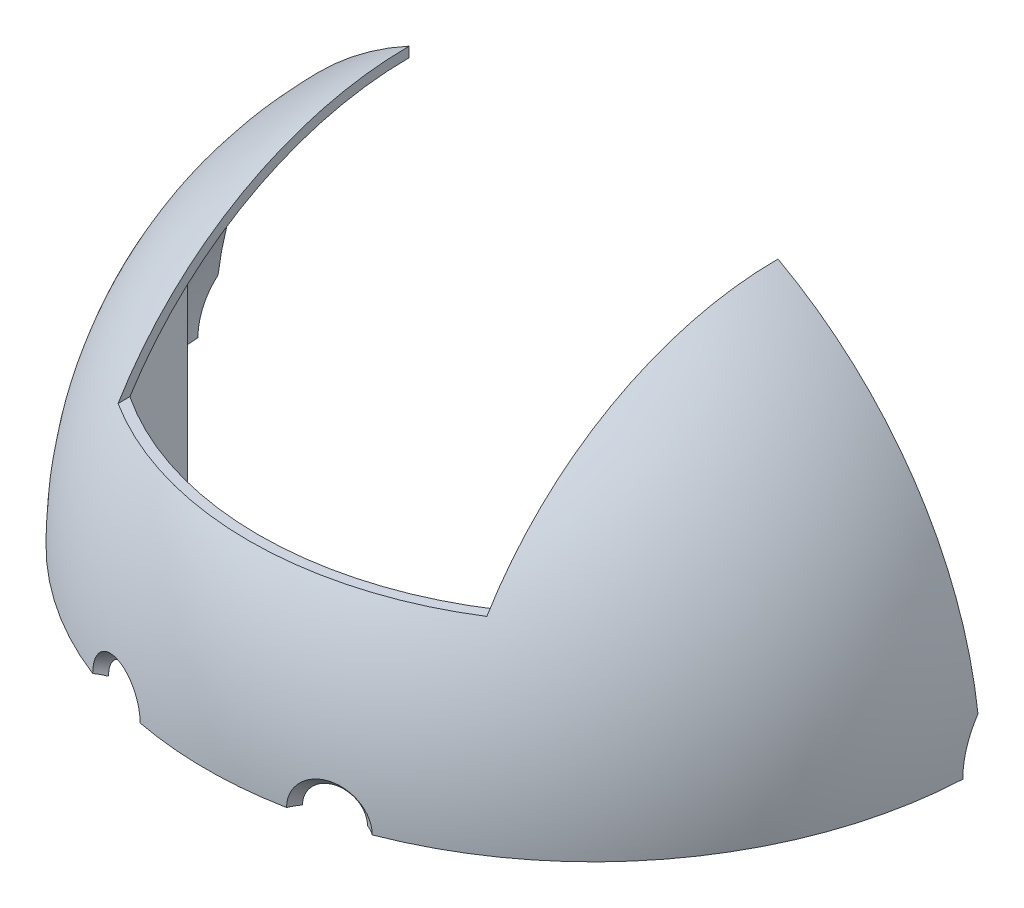
ISO-10303-21;
HEADER;
FILE_DESCRIPTION(('STEP AP214'),'2;1');
FILE_NAME('part.step','',(''),(''),'','','');
FILE_SCHEMA(('AUTOMOTIVE_DESIGN { 1 0 10303 214 1 1 1 1 }'));
ENDSEC;
DATA;
#1=APPLICATION_CONTEXT('core data for automotive mechanical design processes');
#2=APPLICATION_PROTOCOL_DEFINITION('international standard','automotive_design',2000,#1);
#3=PRODUCT_CONTEXT('',#1,'mechanical');
#4=PRODUCT('Part','Part','',(#3));
#5=PRODUCT_RELATED_PRODUCT_CATEGORY('part','',(#4));
#6=PRODUCT_DEFINITION_FORMATION('','',#4);
#7=PRODUCT_DEFINITION_CONTEXT('part definition',#1,'design');
#8=PRODUCT_DEFINITION('design','',#6,#7);
#9=PRODUCT_DEFINITION_SHAPE('','',#8);
#10=(LENGTH_UNIT() NAMED_UNIT(*) SI_UNIT(.MILLI.,.METRE.));
#11=(NAMED_UNIT(*) PLANE_ANGLE_UNIT() SI_UNIT($,.RADIAN.));
#12=(NAMED_UNIT(*) SI_UNIT($,.STERADIAN.) SOLID_ANGLE_UNIT());
#13=UNCERTAINTY_MEASURE_WITH_UNIT(LENGTH_MEASURE(1.E-05),#10,'distance_accuracy_value','');
#14=(GEOMETRIC_REPRESENTATION_CONTEXT(3) GLOBAL_UNCERTAINTY_ASSIGNED_CONTEXT((#13)) GLOBAL_UNIT_ASSIGNED_CONTEXT((#10,
#11,#12)) REPRESENTATION_CONTEXT('',''));
#15=CARTESIAN_POINT('',(0.,0.,0.));
#16=DIRECTION('',(0.,0.,1.));
#17=DIRECTION('',(1.,0.,0.));
#18=AXIS2_PLACEMENT_3D('',#15,#16,#17);
#19=CARTESIAN_POINT('',(0.,0.,25.4));
#20=DIRECTION('',(1.,0.,0.));
#21=DIRECTION('',(0.,1.,0.));
#22=AXIS2_PLACEMENT_3D('',#19,#20,#21);
#23=SPHERICAL_SURFACE('',#22,69.85);
#24=CARTESIAN_POINT('',(-19.2074436772505,0.,92.265971471552));
#25=DIRECTION('',(-0.276088046524378,0.,0.96113234810111));
#26=DIRECTION('',(0.96113234810111,0.,0.276088046524378));
#27=AXIS2_PLACEMENT_3D('',#24,#25,#26);
#28=CIRCLE('',#27,6.24807702824202);
#29=CARTESIAN_POINT('',(-13.2022147319796,0.,93.9909908528132));
#30=VERTEX_POINT('',#29);
#31=CARTESIAN_POINT('',(-25.2126726225213,0.,90.5409520902908));
#32=VERTEX_POINT('',#31);
#33=EDGE_CURVE('E177',#30,#32,#28,.T.);
#34=ORIENTED_EDGE('',*,*,#33,.F.);
#35=CARTESIAN_POINT('',(0.,0.,25.4));
#36=DIRECTION('',(0.,1.,0.));
#37=DIRECTION('',(0.,0.,-1.));
#38=AXIS2_PLACEMENT_3D('',#35,#36,#37);
#39=CIRCLE('',#38,69.85);
#40=CARTESIAN_POINT('',(13.2022147319796,0.,93.9909908528132));
#41=VERTEX_POINT('',#40);
#42=EDGE_CURVE('E186',#30,#41,#39,.T.);
#43=ORIENTED_EDGE('',*,*,#42,.T.);
#44=CARTESIAN_POINT('',(19.2074436772505,0.,92.265971471552));
#45=DIRECTION('',(0.276088046524378,0.,0.96113234810111));
#46=DIRECTION('',(0.96113234810111,0.,-0.276088046524378));
#47=AXIS2_PLACEMENT_3D('',#44,#45,#46);
#48=CIRCLE('',#47,6.24807702824202);
#49=CARTESIAN_POINT('',(25.2126726225213,0.,90.5409520902908));
#50=VERTEX_POINT('',#49);
#51=EDGE_CURVE('E250',#50,#41,#48,.T.);
#52=ORIENTED_EDGE('',*,*,#51,.F.);
#53=CARTESIAN_POINT('',(69.777803598279,0.,28.575));
#54=VERTEX_POINT('',#53);
#55=EDGE_CURVE('E196',#50,#54,#39,.T.);
#56=ORIENTED_EDGE('',*,*,#55,.T.);
#57=CARTESIAN_POINT('',(69.777803598064,-0.0002,28.5749999984252));
#58=CARTESIAN_POINT('',(69.7778094286927,0.35419238493466,28.5750454404267));
#59=CARTESIAN_POINT('',(69.7757804396735,0.708578025886953,28.5601789188218));
#60=CARTESIAN_POINT('',(69.7676893456543,1.41481913493722,28.5009092542895));
#61=CARTESIAN_POINT('',(69.7616273114968,1.76667464736844,28.4565066301789));
#62=CARTESIAN_POINT('',(69.74549664725,2.46578488457666,28.338378809471));
#63=CARTESIAN_POINT('',(69.7354230552833,2.81303335922335,28.2646172990596));
#64=CARTESIAN_POINT('',(69.7113421244648,3.49999314625604,28.0883438305232));
#65=CARTESIAN_POINT('',(69.6973350079172,3.83970488341228,27.9858334971454));
#66=CARTESIAN_POINT('',(69.6654751357279,4.50939441102191,27.7527583961394));
#67=CARTESIAN_POINT('',(69.6476201857103,4.83936652448324,27.6221776203617));
#68=CARTESIAN_POINT('',(69.6081933718184,5.48704875240924,27.3339669868172));
#69=CARTESIAN_POINT('',(69.5866215317765,5.80475894547963,27.1763373024843));
#70=CARTESIAN_POINT('',(69.5399673804505,6.4249444157689,26.8356113155748));
#71=CARTESIAN_POINT('',(69.5148934745958,6.72745388004004,26.6525759962917));
#72=CARTESIAN_POINT('',(69.4613780965593,7.31582988259074,26.2621631060731));
#73=CARTESIAN_POINT('',(69.4329386638847,7.60170634535006,26.0548002782436));
#74=CARTESIAN_POINT('',(69.3932555388993,7.96730068186584,25.7656533286922));
#75=CARTESIAN_POINT('',(69.3834279824395,8.05536684081896,25.6940605662914));
#76=CARTESIAN_POINT('',(69.3634592706024,8.22945153250354,25.548622434634));
#77=CARTESIAN_POINT('',(69.3533183957594,8.31547178152869,25.4747790812367));
#78=CARTESIAN_POINT('',(69.3430192232787,8.40048718587201,25.3998));
#79=B_SPLINE_CURVE_WITH_KNOTS('',3,(#57,#58,#59,#60,#61,#62,#63,#64,#65,#66,#67,#68,#69,#70,#71,
#72,#73,#74,#75,#76,#77,#78),.UNSPECIFIED.,.F.,.F.,(4,2,2,2,2,2,2,2,2,2,4),(0.,1.06284917204437,
2.12567967509618,3.18982889195358,4.25391798025308,5.31861552003499,6.38330623337973,
7.44548410846703,8.50702156921451,8.8487524031558,9.19018565776057),.UNSPECIFIED.);
#80=CARTESIAN_POINT('',(69.3430466953969,8.40026041263011,25.4));
#81=VERTEX_POINT('',#80);
#82=EDGE_CURVE('E238',#54,#81,#79,.T.);
#83=ORIENTED_EDGE('',*,*,#82,.T.);
#84=CARTESIAN_POINT('',(0.,0.,25.4));
#85=DIRECTION('',(0.,0.,-1.));
#86=DIRECTION('',(0.,-1.,0.));
#87=AXIS2_PLACEMENT_3D('',#84,#85,#86);
#88=CIRCLE('',#87,69.85);
#89=CARTESIAN_POINT('',(33.2590191582997,61.4236122727071,25.3999999999998));
#90=VERTEX_POINT('',#89);
#91=EDGE_CURVE('E200',#90,#81,#88,.T.);
#92=ORIENTED_EDGE('',*,*,#91,.F.);
#93=CARTESIAN_POINT('',(33.2590191582997,0.,25.4));
#94=DIRECTION('',(-1.,0.,0.));
#95=DIRECTION('',(0.,0.,1.));
#96=AXIS2_PLACEMENT_3D('',#93,#94,#95);
#97=CIRCLE('',#96,61.4236122727071);
#98=CARTESIAN_POINT('',(33.2590191582997,31.8494770449744,77.921147708228));
#99=VERTEX_POINT('',#98);
#100=EDGE_CURVE('E338',#99,#90,#97,.T.);
#101=ORIENTED_EDGE('',*,*,#100,.F.);
#102=CARTESIAN_POINT('',(0.,31.8494770449744,25.4));
#103=DIRECTION('',(0.,1.,0.));
#104=DIRECTION('',(0.,0.,1.));
#105=AXIS2_PLACEMENT_3D('',#102,#103,#104);
#106=CIRCLE('',#105,62.166174982555);
#107=CARTESIAN_POINT('',(-33.2590191582997,31.8494770449744,77.921147708228));
#108=VERTEX_POINT('',#107);
#109=EDGE_CURVE('E341',#108,#99,#106,.T.);
#110=ORIENTED_EDGE('',*,*,#109,.F.);
#111=CARTESIAN_POINT('',(-33.2590191582997,0.,25.4));
#112=DIRECTION('',(1.,0.,0.));
#113=DIRECTION('',(0.,0.,-1.));
#114=AXIS2_PLACEMENT_3D('',#111,#112,#113);
#115=CIRCLE('',#114,61.4236122727071);
#116=CARTESIAN_POINT('',(-33.2590191582997,61.4236122727071,25.3999999999998));
#117=VERTEX_POINT('',#116);
#118=EDGE_CURVE('E348',#117,#108,#115,.T.);
#119=ORIENTED_EDGE('',*,*,#118,.F.);
#120=CARTESIAN_POINT('',(-69.3430466953969,8.40026041263011,25.4));
#121=VERTEX_POINT('',#120);
#122=EDGE_CURVE('E205',#121,#117,#88,.T.);
#123=ORIENTED_EDGE('',*,*,#122,.F.);
#124=CARTESIAN_POINT('',(-69.3430192232787,8.40048718587201,25.3998));
#125=CARTESIAN_POINT('',(-69.3751919554918,8.13497556913375,25.6340214653112));
#126=CARTESIAN_POINT('',(-69.4058221966783,7.85951556077259,25.8571754418203));
#127=CARTESIAN_POINT('',(-69.4638058862443,7.29069001217986,26.2798613972095));
#128=CARTESIAN_POINT('',(-69.4911591987702,6.99732373035803,26.479392396734));
#129=CARTESIAN_POINT('',(-69.5424399560993,6.39416482943089,26.8536573134017));
#130=CARTESIAN_POINT('',(-69.5663612388711,6.08434399997873,27.0283466237371));
#131=CARTESIAN_POINT('',(-69.6105533918674,5.45095903302394,27.351208916315));
#132=CARTESIAN_POINT('',(-69.630824526799,5.1273958942123,27.4993838213654));
#133=CARTESIAN_POINT('',(-69.6675928156673,4.46850106258316,27.7682427958347));
#134=CARTESIAN_POINT('',(-69.6840866253628,4.1331592421357,27.8889025043742));
#135=CARTESIAN_POINT('',(-69.7131612950436,3.45336754140404,28.1016546543018));
#136=CARTESIAN_POINT('',(-69.7257422175212,3.10891780667628,28.1937475519261));
#137=CARTESIAN_POINT('',(-69.746875407551,2.41429207994767,28.3484720593326));
#138=CARTESIAN_POINT('',(-69.7554379653327,2.06413311671602,28.4111789202917));
#139=CARTESIAN_POINT('',(-69.7685181734764,1.35987050584993,28.5069795207709));
#140=CARTESIAN_POINT('',(-69.7730383637668,1.00576947694763,28.5400918553218));
#141=CARTESIAN_POINT('',(-69.7762846405911,0.542523168682234,28.5638726048134));
#142=CARTESIAN_POINT('',(-69.7768546589657,0.433972461882385,28.5680483497382));
#143=CARTESIAN_POINT('',(-69.7776140491352,0.216884931342977,28.5736113966535));
#144=CARTESIAN_POINT('',(-69.7778037242217,0.108348165607745,28.57500092042));
#145=CARTESIAN_POINT('',(-69.777803598064,-0.000200000000000019,28.5749999984252));
#146=B_SPLINE_CURVE_WITH_KNOTS('',3,(#124,#125,#126,#127,#128,#129,#130,#131,#132,#133,#134,
#135,#136,#137,#138,#139,#140,#141,#142,#143,#144,#145),.UNSPECIFIED.,.F.,.F.,(4,2,2,2,2,2,2,2,
2,2,4),(0.,1.06623370991969,2.1325116080268,3.20068061674634,4.26877213110154,5.33780565189201,
6.40682209843502,7.47308586472777,8.53867919708758,8.86455172893833,9.19016430146493),.UNSPECIFIED.);
#147=CARTESIAN_POINT('',(-69.777803598279,0.,28.575));
#148=VERTEX_POINT('',#147);
#149=EDGE_CURVE('E320',#121,#148,#146,.T.);
#150=ORIENTED_EDGE('',*,*,#149,.T.);
#151=EDGE_CURVE('E190',#148,#32,#39,.T.);
#152=ORIENTED_EDGE('',*,*,#151,.T.);
#153=EDGE_LOOP('',(#34,#43,#52,#56,#83,#92,#101,#110,#119,#123,#150,#152));
#154=FACE_BOUND('',#153,.T.);
#155=ADVANCED_FACE('F39',(#154),#23,.T.);
#156=CARTESIAN_POINT('',(0.,0.,25.4));
#157=DIRECTION('',(1.,0.,0.));
#158=DIRECTION('',(0.,1.,0.));
#159=AXIS2_PLACEMENT_3D('',#156,#157,#158);
#160=SPHERICAL_SURFACE('',#159,68.2625);
#161=CARTESIAN_POINT('',(0.,0.,25.4));
#162=DIRECTION('',(0.,-1.,0.));
#163=DIRECTION('',(0.,0.,-1.));
#164=AXIS2_PLACEMENT_3D('',#161,#162,#163);
#165=CIRCLE('',#164,68.2625);
#166=CARTESIAN_POINT('',(-14.2462848519296,0.,92.1593609478677));
#167=VERTEX_POINT('',#166);
#168=CARTESIAN_POINT('',(14.2462848519299,0.,92.1593609478676));
#169=VERTEX_POINT('',#168);
#170=EDGE_CURVE('E263',#167,#169,#165,.F.);
#171=ORIENTED_EDGE('',*,*,#170,.F.);
#172=CARTESIAN_POINT('',(-18.8009914184672,0.,90.8510083147142));
#173=DIRECTION('',(-0.276088046524378,0.,0.96113234810111));
#174=DIRECTION('',(0.96113234810111,0.,0.276088046524378));
#175=AXIS2_PLACEMENT_3D('',#172,#173,#174);
#176=CIRCLE('',#175,4.73889633986001);
#177=CARTESIAN_POINT('',(-23.3556979850046,0.,89.5426556815607));
#178=VERTEX_POINT('',#177);
#179=EDGE_CURVE('E55',#167,#178,#176,.T.);
#180=ORIENTED_EDGE('',*,*,#179,.T.);
#181=CARTESIAN_POINT('',(-64.0596450311874,0.,48.9824253360054));
#182=VERTEX_POINT('',#181);
#183=EDGE_CURVE('E260',#182,#178,#165,.F.);
#184=ORIENTED_EDGE('',*,*,#183,.F.);
#185=CARTESIAN_POINT('',(-43.8210351835967,0.,69.2210351835963));
#186=DIRECTION('',(0.707106781186551,0.,-0.707106781186544));
#187=DIRECTION('',(-0.707106781186544,0.,-0.707106781186551));
#188=AXIS2_PLACEMENT_3D('',#185,#186,#187);
#189=CIRCLE('',#188,28.6217165300406);
#190=CARTESIAN_POINT('',(-48.0789347262059,27.9811229241446,64.963135640987));
#191=VERTEX_POINT('',#190);
#192=EDGE_CURVE('E259',#191,#182,#189,.F.);
#193=ORIENTED_EDGE('',*,*,#192,.F.);
#194=CARTESIAN_POINT('',(-4.25789954260911,0.,21.1421004573908));
#195=DIRECTION('',(-0.707106781186543,0.,-0.707106781186552));
#196=DIRECTION('',(-0.707106781186552,0.,0.707106781186543));
#197=AXIS2_PLACEMENT_3D('',#194,#195,#196);
#198=CIRCLE('',#197,67.9963932074349);
#199=CARTESIAN_POINT('',(-40.8947298293505,44.0340189206158,57.7789307441318));
#200=VERTEX_POINT('',#199);
#201=EDGE_CURVE('E265',#200,#191,#198,.F.);
#202=ORIENTED_EDGE('',*,*,#201,.F.);
#203=CARTESIAN_POINT('',(-36.6368302867413,0.,62.036830286741));
#204=DIRECTION('',(-0.707106781186551,0.,0.707106781186544));
#205=DIRECTION('',(0.707106781186544,0.,0.707106781186551));
#206=AXIS2_PLACEMENT_3D('',#203,#204,#205);
#207=CIRCLE('',#206,44.4438324104825);
#208=CARTESIAN_POINT('',(-64.2433957441302,21.2369801672658,34.4302648293518));
#209=VERTEX_POINT('',#208);
#210=EDGE_CURVE('E414',#209,#200,#207,.F.);
#211=ORIENTED_EDGE('',*,*,#210,.F.);
#212=CARTESIAN_POINT('',(-27.6065654573889,0.,-2.20656545738913));
#213=DIRECTION('',(0.707106781186544,0.,0.707106781186551));
#214=DIRECTION('',(0.707106781186551,0.,-0.707106781186544));
#215=AXIS2_PLACEMENT_3D('',#212,#213,#214);
#216=CIRCLE('',#215,55.9957497810663);
#217=CARTESIAN_POINT('',(-67.2015398452062,0.,37.3884089304278));
#218=VERTEX_POINT('',#217);
#219=EDGE_CURVE('E406',#218,#209,#216,.F.);
#220=ORIENTED_EDGE('',*,*,#219,.F.);
#221=CARTESIAN_POINT('',(-68.1886228138536,0.,28.575));
#222=VERTEX_POINT('',#221);
#223=EDGE_CURVE('E267',#222,#218,#165,.F.);
#224=ORIENTED_EDGE('',*,*,#223,.F.);
#225=CARTESIAN_POINT('',(-67.7436397106769,8.40048718587201,25.3998));
#226=CARTESIAN_POINT('',(-67.7765600984674,8.13507166827011,25.6339367151209));
#227=CARTESIAN_POINT('',(-67.8079022789301,7.85970965051198,25.8570185402988));
#228=CARTESIAN_POINT('',(-67.8672342947096,7.29108024709969,26.279584056902));
#229=CARTESIAN_POINT('',(-67.8952239849812,6.99781208756578,26.479066727307));
#230=CARTESIAN_POINT('',(-67.9476988859511,6.39484498251881,26.85325792144));
#231=CARTESIAN_POINT('',(-67.9721777677059,6.08511770963238,27.0279216989722));
#232=CARTESIAN_POINT('',(-68.0174012179107,5.45191514058943,27.350751992087));
#233=CARTESIAN_POINT('',(-68.0381460590105,5.12844085033723,27.4989204422828));
#234=CARTESIAN_POINT('',(-68.0757753024839,4.4697143095719,27.7677846338967));
#235=CARTESIAN_POINT('',(-68.0926562461765,4.13445181433524,27.8884557612757));
#236=CARTESIAN_POINT('',(-68.1224152889791,3.45481169657027,28.1012447187725));
#237=CARTESIAN_POINT('',(-68.1352934526865,3.1104342212377,28.1933630096787));
#238=CARTESIAN_POINT('',(-68.1569285256066,2.41594632579931,28.3481500291579));
#239=CARTESIAN_POINT('',(-68.1656959684495,2.0658529640348,28.4108940280708));
#240=CARTESIAN_POINT('',(-68.1790929903931,1.36171509399341,28.5067792320726));
#241=CARTESIAN_POINT('',(-68.1837251676458,1.00767320833317,28.5399390246568));
#242=CARTESIAN_POINT('',(-68.1870590736792,0.544157193057058,28.5638054453005));
#243=CARTESIAN_POINT('',(-68.1876458970775,0.435279892004859,28.5680063882231));
#244=CARTESIAN_POINT('',(-68.1884276754352,0.217538841274858,28.5736030078841));
#245=CARTESIAN_POINT('',(-68.1886229430949,0.108675150265408,28.5750009231482));
#246=CARTESIAN_POINT('',(-68.1886228136337,-0.000199999999999949,28.5749999984252));
#247=B_SPLINE_CURVE_WITH_KNOTS('',3,(#225,#226,#227,#228,#229,#230,#231,#232,#233,#234,#235,
#236,#237,#238,#239,#240,#241,#242,#243,#244,#245,#246),.UNSPECIFIED.,.F.,.F.,(4,2,2,2,2,2,2,2,
2,2,4),(0.,1.06605693510379,2.13215997643534,3.20016135778826,4.26808472485893,5.33696031344368,
6.40581865151873,7.47192288956418,8.53735683106578,8.864211281711,9.19080459903572),.UNSPECIFIED.);
#248=CARTESIAN_POINT('',(-67.7436678313922,8.40026041263011,25.4));
#249=VERTEX_POINT('',#248);
#250=EDGE_CURVE('E310',#249,#222,#247,.T.);
#251=ORIENTED_EDGE('',*,*,#250,.F.);
#252=CARTESIAN_POINT('',(0.,0.,25.4));
#253=DIRECTION('',(0.,0.,1.));
#254=DIRECTION('',(0.,-1.,0.));
#255=AXIS2_PLACEMENT_3D('',#252,#253,#254);
#256=CIRCLE('',#255,68.2625);
#257=CARTESIAN_POINT('',(-33.2590191582997,59.6121342587048,25.3999999999998));
#258=VERTEX_POINT('',#257);
#259=EDGE_CURVE('E201',#249,#258,#256,.F.);
#260=ORIENTED_EDGE('',*,*,#259,.T.);
#261=CARTESIAN_POINT('',(-33.2590191582997,0.,25.4));
#262=DIRECTION('',(1.,0.,0.));
#263=DIRECTION('',(0.,0.,-1.));
#264=AXIS2_PLACEMENT_3D('',#261,#262,#263);
#265=CIRCLE('',#264,59.6121342587048);
#266=CARTESIAN_POINT('',(-33.2590191582997,31.8494770449744,75.790647573131));
#267=VERTEX_POINT('',#266);
#268=EDGE_CURVE('E216',#258,#267,#265,.T.);
#269=ORIENTED_EDGE('',*,*,#268,.T.);
#270=CARTESIAN_POINT('',(0.,31.8494770449744,25.4));
#271=DIRECTION('',(0.,1.,0.));
#272=DIRECTION('',(0.,0.,1.));
#273=AXIS2_PLACEMENT_3D('',#270,#271,#272);
#274=CIRCLE('',#273,60.3769800355371);
#275=CARTESIAN_POINT('',(33.2590191582997,31.8494770449744,75.790647573131));
#276=VERTEX_POINT('',#275);
#277=EDGE_CURVE('E212',#267,#276,#274,.T.);
#278=ORIENTED_EDGE('',*,*,#277,.T.);
#279=CARTESIAN_POINT('',(33.2590191582997,0.,25.4));
#280=DIRECTION('',(-1.,0.,0.));
#281=DIRECTION('',(0.,0.,1.));
#282=AXIS2_PLACEMENT_3D('',#279,#280,#281);
#283=CIRCLE('',#282,59.6121342587048);
#284=CARTESIAN_POINT('',(33.2590191582997,59.6121342587048,25.3999999999998));
#285=VERTEX_POINT('',#284);
#286=EDGE_CURVE('E208',#276,#285,#283,.T.);
#287=ORIENTED_EDGE('',*,*,#286,.T.);
#288=CARTESIAN_POINT('',(67.7436678313922,8.4002604126301,25.4));
#289=VERTEX_POINT('',#288);
#290=EDGE_CURVE('E247',#285,#289,#256,.F.);
#291=ORIENTED_EDGE('',*,*,#290,.T.);
#292=CARTESIAN_POINT('',(68.1886228136337,-0.0002,28.5749999984252));
#293=CARTESIAN_POINT('',(68.1886287731267,0.354081263096001,28.5750455154823));
#294=CARTESIAN_POINT('',(68.1865538029706,0.708355730274578,28.5601882205129));
#295=CARTESIAN_POINT('',(68.1782793336124,1.41437441365656,28.5009559011221));
#296=CARTESIAN_POINT('',(68.1720799105971,1.76611867647656,28.4565814219419));
#297=CARTESIAN_POINT('',(68.1555837798802,2.46500076151619,28.3385304498082));
#298=CARTESIAN_POINT('',(68.145282069412,2.81213242252516,28.2648181792827));
#299=CARTESIAN_POINT('',(68.1206557997255,3.49886032359216,28.0886647156469));
#300=CARTESIAN_POINT('',(68.1063314668847,3.83845698653026,27.9862251391971));
#301=CARTESIAN_POINT('',(68.0737500372515,4.50791775352191,27.7533148469879));
#302=CARTESIAN_POINT('',(68.0554907142288,4.8377762275619,27.6228282636743));
#303=CARTESIAN_POINT('',(68.0151707598923,5.48523625921991,27.3348302394552));
#304=CARTESIAN_POINT('',(67.9931101519214,5.80283789208951,27.1773189645019));
#305=CARTESIAN_POINT('',(67.9453983446459,6.42281666241268,26.8368534047209));
#306=CARTESIAN_POINT('',(67.9197557120738,6.72522784954203,26.6539598305281));
#307=CARTESIAN_POINT('',(67.8650258600165,7.31341791247077,26.2638559584727));
#308=CARTESIAN_POINT('',(67.835940722473,7.59920668668033,26.0566603585513));
#309=CARTESIAN_POINT('',(67.7953031197872,7.96517069516488,25.7673750730058));
#310=CARTESIAN_POINT('',(67.7851975866101,8.05367728511352,25.695452758806));
#311=CARTESIAN_POINT('',(67.7646622935057,8.22862218454982,25.5493343394733));
#312=CARTESIAN_POINT('',(67.7542328251957,8.3150622370383,25.47514028025));
#313=CARTESIAN_POINT('',(67.7436397106769,8.40048718587202,25.3998));
#314=B_SPLINE_CURVE_WITH_KNOTS('',3,(#292,#293,#294,#295,#296,#297,#298,#299,#300,#301,#302,
#303,#304,#305,#306,#307,#308,#309,#310,#311,#312,#313),.UNSPECIFIED.,.F.,.F.,(4,2,2,2,2,2,2,2,
2,2,4),(0.,1.06251574484267,2.12501186344749,3.18880769072763,4.25254366374235,5.31688303537703,
6.3812158713985,7.44304550477881,8.5042362199794,8.84768191122949,9.19082690471824),.UNSPECIFIED.);
#315=CARTESIAN_POINT('',(68.1886228138536,0.,28.575));
#316=VERTEX_POINT('',#315);
#317=EDGE_CURVE('E235',#316,#289,#314,.T.);
#318=ORIENTED_EDGE('',*,*,#317,.F.);
#319=CARTESIAN_POINT('',(67.2015398452062,0.,37.3884089304277));
#320=VERTEX_POINT('',#319);
#321=EDGE_CURVE('E245',#320,#316,#165,.F.);
#322=ORIENTED_EDGE('',*,*,#321,.F.);
#323=CARTESIAN_POINT('',(27.6065654573898,0.,-2.20656545738934));
#324=DIRECTION('',(-0.707106781186554,0.,0.707106781186541));
#325=DIRECTION('',(0.707106781186541,0.,0.707106781186554));
#326=AXIS2_PLACEMENT_3D('',#323,#324,#325);
#327=CIRCLE('',#326,55.9957497810658);
#328=CARTESIAN_POINT('',(64.2433957441305,21.2369801672647,34.430264829352));
#329=VERTEX_POINT('',#328);
#330=EDGE_CURVE('E380',#329,#320,#327,.F.);
#331=ORIENTED_EDGE('',*,*,#330,.F.);
#332=CARTESIAN_POINT('',(36.6368302867407,0.,62.0368302867414));
#333=DIRECTION('',(0.707106781186541,0.,0.707106781186554));
#334=DIRECTION('',(0.707106781186554,0.,-0.707106781186541));
#335=AXIS2_PLACEMENT_3D('',#332,#333,#334);
#336=CIRCLE('',#335,44.4438324104827);
#337=CARTESIAN_POINT('',(40.8947298293506,44.0340189206158,57.7789307441316));
#338=VERTEX_POINT('',#337);
#339=EDGE_CURVE('E377',#338,#329,#336,.F.);
#340=ORIENTED_EDGE('',*,*,#339,.F.);
#341=CARTESIAN_POINT('',(4.25789954260984,0.,21.1421004573903));
#342=DIRECTION('',(0.707106781186554,0.,-0.707106781186541));
#343=DIRECTION('',(-0.707106781186541,0.,-0.707106781186554));
#344=AXIS2_PLACEMENT_3D('',#341,#342,#343);
#345=CIRCLE('',#344,67.9963932074348);
#346=CARTESIAN_POINT('',(48.0789347262058,27.9811229241449,64.963135640987));
#347=VERTEX_POINT('',#346);
#348=EDGE_CURVE('E374',#347,#338,#345,.F.);
#349=ORIENTED_EDGE('',*,*,#348,.F.);
#350=CARTESIAN_POINT('',(43.8210351835959,0.,69.2210351835968));
#351=DIRECTION('',(-0.707106781186541,0.,-0.707106781186554));
#352=DIRECTION('',(-0.707106781186554,0.,0.707106781186541));
#353=AXIS2_PLACEMENT_3D('',#350,#351,#352);
#354=CIRCLE('',#353,28.621716530041);
#355=CARTESIAN_POINT('',(64.0596450311872,0.,48.9824253360059));
#356=VERTEX_POINT('',#355);
#357=EDGE_CURVE('E383',#356,#347,#354,.F.);
#358=ORIENTED_EDGE('',*,*,#357,.F.);
#359=CARTESIAN_POINT('',(23.3556979850048,0.,89.5426556815606));
#360=VERTEX_POINT('',#359);
#361=EDGE_CURVE('E258',#360,#356,#165,.F.);
#362=ORIENTED_EDGE('',*,*,#361,.F.);
#363=CARTESIAN_POINT('',(18.8009914184672,0.,90.8510083147142));
#364=DIRECTION('',(0.276088046524378,0.,0.96113234810111));
#365=DIRECTION('',(0.96113234810111,0.,-0.276088046524378));
#366=AXIS2_PLACEMENT_3D('',#363,#364,#365);
#367=CIRCLE('',#366,4.73889633986001);
#368=EDGE_CURVE('E63',#360,#169,#367,.T.);
#369=ORIENTED_EDGE('',*,*,#368,.T.);
#370=EDGE_LOOP('',(#171,#180,#184,#193,#202,#211,#220,#224,#251,#260,#269,#278,#287,#291,#318,
#322,#331,#340,#349,#358,#362,#369));
#371=FACE_BOUND('',#370,.T.);
#372=ADVANCED_FACE('F243',(#371),#160,.F.);
#373=CARTESIAN_POINT('',(0.,0.,25.4));
#374=DIRECTION('',(0.,-1.,0.));
#375=DIRECTION('',(0.,0.,-1.));
#376=AXIS2_PLACEMENT_3D('',#373,#374,#375);
#377=PLANE('',#376);
#378=ORIENTED_EDGE('',*,*,#183,.T.);
#379=CARTESIAN_POINT('',(-20.5590191582997,0.,96.971147708228));
#380=DIRECTION('',(0.,-1.,0.));
#381=DIRECTION('',(0.,0.,-1.));
#382=AXIS2_PLACEMENT_3D('',#379,#380,#381);
#383=CIRCLE('',#382,7.93750000000001);
#384=EDGE_CURVE('E11',#178,#32,#383,.F.);
#385=ORIENTED_EDGE('',*,*,#384,.T.);
#386=ORIENTED_EDGE('',*,*,#151,.F.);
#387=DIRECTION('',(1.,0.,0.));
#388=VECTOR('',#387,1.);
#389=CARTESIAN_POINT('',(-69.85,0.,28.575));
#390=LINE('',#389,#388);
#391=EDGE_CURVE('E220',#222,#148,#390,.F.);
#392=ORIENTED_EDGE('',*,*,#391,.F.);
#393=ORIENTED_EDGE('',*,*,#223,.T.);
#394=DIRECTION('',(-0.707106781186551,0.,0.707106781186544));
#395=VECTOR('',#394,1.);
#396=CARTESIAN_POINT('',(-71.4276006409856,0.,41.6144697262071));
#397=LINE('',#396,#395);
#398=CARTESIAN_POINT('',(-64.2433957441302,0.,34.4302648293518));
#399=VERTEX_POINT('',#398);
#400=EDGE_CURVE('E395',#399,#218,#397,.T.);
#401=ORIENTED_EDGE('',*,*,#400,.F.);
#402=DIRECTION('',(-0.707106781186544,0.,-0.707106781186551));
#403=VECTOR('',#402,1.);
#404=CARTESIAN_POINT('',(-64.2433957441302,0.,34.4302648293518));
#405=LINE('',#404,#403);
#406=CARTESIAN_POINT('',(-40.8947298293505,0.,57.7789307441318));
#407=VERTEX_POINT('',#406);
#408=EDGE_CURVE('E391',#407,#399,#405,.T.);
#409=ORIENTED_EDGE('',*,*,#408,.F.);
#410=DIRECTION('',(0.707106781186552,0.,-0.707106781186543));
#411=VECTOR('',#410,1.);
#412=CARTESIAN_POINT('',(-48.0789347262059,0.,64.963135640987));
#413=LINE('',#412,#411);
#414=CARTESIAN_POINT('',(-48.0789347262059,0.,64.963135640987));
#415=VERTEX_POINT('',#414);
#416=EDGE_CURVE('E387',#415,#407,#413,.T.);
#417=ORIENTED_EDGE('',*,*,#416,.F.);
#418=DIRECTION('',(0.707106781186544,0.,0.707106781186551));
#419=VECTOR('',#418,1.);
#420=CARTESIAN_POINT('',(-71.4276006409856,0.,41.6144697262071));
#421=LINE('',#420,#419);
#422=EDGE_CURVE('E386',#182,#415,#421,.T.);
#423=ORIENTED_EDGE('',*,*,#422,.F.);
#424=EDGE_LOOP('',(#378,#385,#386,#392,#393,#401,#409,#417,#423));
#425=FACE_BOUND('',#424,.T.);
#426=ADVANCED_FACE('F430',(#425),#377,.T.);
#427=ORIENTED_EDGE('',*,*,#42,.F.);
#428=EDGE_CURVE('E43',#30,#167,#383,.F.);
#429=ORIENTED_EDGE('',*,*,#428,.T.);
#430=ORIENTED_EDGE('',*,*,#170,.T.);
#431=CARTESIAN_POINT('',(20.5590191582997,0.,96.971147708228));
#432=DIRECTION('',(0.,-1.,0.));
#433=DIRECTION('',(0.,0.,-1.));
#434=AXIS2_PLACEMENT_3D('',#431,#432,#433);
#435=CIRCLE('',#434,7.93750000000001);
#436=EDGE_CURVE('E182',#169,#41,#435,.F.);
#437=ORIENTED_EDGE('',*,*,#436,.T.);
#438=EDGE_LOOP('',(#427,#429,#430,#437));
#439=FACE_BOUND('',#438,.T.);
#440=ADVANCED_FACE('F194',(#439),#377,.T.);
#441=CARTESIAN_POINT('',(0.,0.,25.4));
#442=DIRECTION('',(0.,0.,1.));
#443=DIRECTION('',(0.,-1.,0.));
#444=AXIS2_PLACEMENT_3D('',#441,#442,#443);
#445=PLANE('',#444);
#446=ORIENTED_EDGE('',*,*,#259,.F.);
#447=DIRECTION('',(1.,0.,0.));
#448=VECTOR('',#447,1.);
#449=CARTESIAN_POINT('',(-69.85,8.40026041263011,25.4));
#450=LINE('',#449,#448);
#451=EDGE_CURVE('E317',#249,#121,#450,.F.);
#452=ORIENTED_EDGE('',*,*,#451,.T.);
#453=ORIENTED_EDGE('',*,*,#122,.T.);
#454=DIRECTION('',(0.,1.,0.));
#455=VECTOR('',#454,1.);
#456=CARTESIAN_POINT('',(-33.2590191582997,0.,25.4));
#457=LINE('',#456,#455);
#458=EDGE_CURVE('E344',#258,#117,#457,.T.);
#459=ORIENTED_EDGE('',*,*,#458,.F.);
#460=EDGE_LOOP('',(#446,#452,#453,#459));
#461=FACE_BOUND('',#460,.T.);
#462=ADVANCED_FACE('F465',(#461),#445,.F.);
#463=ORIENTED_EDGE('',*,*,#91,.T.);
#464=DIRECTION('',(1.,0.,0.));
#465=VECTOR('',#464,1.);
#466=CARTESIAN_POINT('',(-69.85,8.40026041263011,25.4));
#467=LINE('',#466,#465);
#468=EDGE_CURVE('E249',#81,#289,#467,.F.);
#469=ORIENTED_EDGE('',*,*,#468,.T.);
#470=ORIENTED_EDGE('',*,*,#290,.F.);
#471=DIRECTION('',(0.,-1.,0.));
#472=VECTOR('',#471,1.);
#473=CARTESIAN_POINT('',(33.2590191582997,0.,25.4));
#474=LINE('',#473,#472);
#475=EDGE_CURVE('E335',#90,#285,#474,.T.);
#476=ORIENTED_EDGE('',*,*,#475,.F.);
#477=EDGE_LOOP('',(#463,#469,#470,#476));
#478=FACE_BOUND('',#477,.T.);
#479=ADVANCED_FACE('F454',(#478),#445,.F.);
#480=ORIENTED_EDGE('',*,*,#55,.F.);
#481=EDGE_CURVE('E223',#50,#360,#435,.F.);
#482=ORIENTED_EDGE('',*,*,#481,.T.);
#483=ORIENTED_EDGE('',*,*,#361,.T.);
#484=DIRECTION('',(0.707106781186554,0.,-0.707106781186541));
#485=VECTOR('',#484,1.);
#486=CARTESIAN_POINT('',(71.4276006409858,0.,41.6144697262074));
#487=LINE('',#486,#485);
#488=CARTESIAN_POINT('',(48.0789347262058,0.,64.963135640987));
#489=VERTEX_POINT('',#488);
#490=EDGE_CURVE('E351',#489,#356,#487,.T.);
#491=ORIENTED_EDGE('',*,*,#490,.F.);
#492=DIRECTION('',(0.707106781186541,0.,0.707106781186554));
#493=VECTOR('',#492,1.);
#494=CARTESIAN_POINT('',(48.0789347262058,0.,64.963135640987));
#495=LINE('',#494,#493);
#496=CARTESIAN_POINT('',(40.8947298293506,0.,57.7789307441316));
#497=VERTEX_POINT('',#496);
#498=EDGE_CURVE('E359',#497,#489,#495,.T.);
#499=ORIENTED_EDGE('',*,*,#498,.F.);
#500=DIRECTION('',(-0.707106781186554,0.,0.707106781186541));
#501=VECTOR('',#500,1.);
#502=CARTESIAN_POINT('',(64.2433957441305,0.,34.430264829352));
#503=LINE('',#502,#501);
#504=CARTESIAN_POINT('',(64.2433957441305,0.,34.430264829352));
#505=VERTEX_POINT('',#504);
#506=EDGE_CURVE('E355',#505,#497,#503,.T.);
#507=ORIENTED_EDGE('',*,*,#506,.F.);
#508=DIRECTION('',(-0.707106781186541,0.,-0.707106781186554));
#509=VECTOR('',#508,1.);
#510=CARTESIAN_POINT('',(71.4276006409858,0.,41.6144697262074));
#511=LINE('',#510,#509);
#512=EDGE_CURVE('E255',#320,#505,#511,.T.);
#513=ORIENTED_EDGE('',*,*,#512,.F.);
#514=ORIENTED_EDGE('',*,*,#321,.T.);
#515=EDGE_CURVE('E222',#54,#316,#390,.F.);
#516=ORIENTED_EDGE('',*,*,#515,.F.);
#517=EDGE_LOOP('',(#480,#482,#483,#491,#499,#507,#513,#514,#516));
#518=FACE_BOUND('',#517,.T.);
#519=ADVANCED_FACE('F252',(#518),#377,.T.);
#520=CARTESIAN_POINT('',(-71.4276006409856,69.852,41.6144697262071));
#521=DIRECTION('',(0.707106781186551,0.,-0.707106781186544));
#522=DIRECTION('',(-0.707106781186544,0.,-0.707106781186551));
#523=AXIS2_PLACEMENT_3D('',#520,#521,#522);
#524=PLANE('',#523);
#525=DIRECTION('',(0.,-1.,0.));
#526=VECTOR('',#525,1.);
#527=CARTESIAN_POINT('',(-48.0789347262059,69.852,64.963135640987));
#528=LINE('',#527,#526);
#529=EDGE_CURVE('E403',#191,#415,#528,.T.);
#530=ORIENTED_EDGE('',*,*,#529,.F.);
#531=ORIENTED_EDGE('',*,*,#192,.T.);
#532=ORIENTED_EDGE('',*,*,#422,.T.);
#533=EDGE_LOOP('',(#530,#531,#532));
#534=FACE_BOUND('',#533,.T.);
#535=ADVANCED_FACE('F426',(#534),#524,.F.);
#536=CARTESIAN_POINT('',(-48.0789347262059,69.852,64.963135640987));
#537=DIRECTION('',(-0.707106781186543,0.,-0.707106781186552));
#538=DIRECTION('',(-0.707106781186552,0.,0.707106781186543));
#539=AXIS2_PLACEMENT_3D('',#536,#537,#538);
#540=PLANE('',#539);
#541=DIRECTION('',(0.,-1.,0.));
#542=VECTOR('',#541,1.);
#543=CARTESIAN_POINT('',(-40.8947298293505,69.852,57.7789307441318));
#544=LINE('',#543,#542);
#545=EDGE_CURVE('E407',#200,#407,#544,.T.);
#546=ORIENTED_EDGE('',*,*,#545,.F.);
#547=ORIENTED_EDGE('',*,*,#201,.T.);
#548=ORIENTED_EDGE('',*,*,#529,.T.);
#549=ORIENTED_EDGE('',*,*,#416,.T.);
#550=EDGE_LOOP('',(#546,#547,#548,#549));
#551=FACE_BOUND('',#550,.T.);
#552=ADVANCED_FACE('F422',(#551),#540,.F.);
#553=CARTESIAN_POINT('',(-64.2433957441302,69.852,34.4302648293518));
#554=DIRECTION('',(-0.707106781186551,0.,0.707106781186544));
#555=DIRECTION('',(0.707106781186544,0.,0.707106781186551));
#556=AXIS2_PLACEMENT_3D('',#553,#554,#555);
#557=PLANE('',#556);
#558=DIRECTION('',(0.,-1.,0.));
#559=VECTOR('',#558,1.);
#560=CARTESIAN_POINT('',(-64.2433957441302,69.852,34.4302648293518));
#561=LINE('',#560,#559);
#562=EDGE_CURVE('E399',#209,#399,#561,.T.);
#563=ORIENTED_EDGE('',*,*,#562,.F.);
#564=ORIENTED_EDGE('',*,*,#210,.T.);
#565=ORIENTED_EDGE('',*,*,#545,.T.);
#566=ORIENTED_EDGE('',*,*,#408,.T.);
#567=EDGE_LOOP('',(#563,#564,#565,#566));
#568=FACE_BOUND('',#567,.T.);
#569=ADVANCED_FACE('F434',(#568),#557,.F.);
#570=CARTESIAN_POINT('',(-71.4276006409856,69.852,41.6144697262071));
#571=DIRECTION('',(0.707106781186544,0.,0.707106781186551));
#572=DIRECTION('',(0.707106781186551,0.,-0.707106781186544));
#573=AXIS2_PLACEMENT_3D('',#570,#571,#572);
#574=PLANE('',#573);
#575=ORIENTED_EDGE('',*,*,#400,.T.);
#576=ORIENTED_EDGE('',*,*,#219,.T.);
#577=ORIENTED_EDGE('',*,*,#562,.T.);
#578=EDGE_LOOP('',(#575,#576,#577));
#579=FACE_BOUND('',#578,.T.);
#580=ADVANCED_FACE('F439',(#579),#574,.F.);
#581=CARTESIAN_POINT('',(71.4276006409858,69.852,41.6144697262074));
#582=DIRECTION('',(-0.707106781186554,0.,0.707106781186541));
#583=DIRECTION('',(0.707106781186541,0.,0.707106781186554));
#584=AXIS2_PLACEMENT_3D('',#581,#582,#583);
#585=PLANE('',#584);
#586=DIRECTION('',(0.,-1.,0.));
#587=VECTOR('',#586,1.);
#588=CARTESIAN_POINT('',(64.2433957441305,69.852,34.430264829352));
#589=LINE('',#588,#587);
#590=EDGE_CURVE('E371',#329,#505,#589,.T.);
#591=ORIENTED_EDGE('',*,*,#590,.F.);
#592=ORIENTED_EDGE('',*,*,#330,.T.);
#593=ORIENTED_EDGE('',*,*,#512,.T.);
#594=EDGE_LOOP('',(#591,#592,#593));
#595=FACE_BOUND('',#594,.T.);
#596=ADVANCED_FACE('F441',(#595),#585,.F.);
#597=CARTESIAN_POINT('',(64.2433957441305,69.852,34.430264829352));
#598=DIRECTION('',(0.707106781186541,0.,0.707106781186554));
#599=DIRECTION('',(0.707106781186554,0.,-0.707106781186541));
#600=AXIS2_PLACEMENT_3D('',#597,#598,#599);
#601=PLANE('',#600);
#602=DIRECTION('',(0.,-1.,0.));
#603=VECTOR('',#602,1.);
#604=CARTESIAN_POINT('',(40.8947298293506,69.852,57.7789307441316));
#605=LINE('',#604,#603);
#606=EDGE_CURVE('E368',#338,#497,#605,.T.);
#607=ORIENTED_EDGE('',*,*,#606,.F.);
#608=ORIENTED_EDGE('',*,*,#339,.T.);
#609=ORIENTED_EDGE('',*,*,#590,.T.);
#610=ORIENTED_EDGE('',*,*,#506,.T.);
#611=EDGE_LOOP('',(#607,#608,#609,#610));
#612=FACE_BOUND('',#611,.T.);
#613=ADVANCED_FACE('F447',(#612),#601,.F.);
#614=CARTESIAN_POINT('',(48.0789347262058,69.852,64.963135640987));
#615=DIRECTION('',(0.707106781186554,0.,-0.707106781186541));
#616=DIRECTION('',(-0.707106781186541,0.,-0.707106781186554));
#617=AXIS2_PLACEMENT_3D('',#614,#615,#616);
#618=PLANE('',#617);
#619=DIRECTION('',(0.,-1.,0.));
#620=VECTOR('',#619,1.);
#621=CARTESIAN_POINT('',(48.0789347262058,69.852,64.963135640987));
#622=LINE('',#621,#620);
#623=EDGE_CURVE('E354',#347,#489,#622,.T.);
#624=ORIENTED_EDGE('',*,*,#623,.F.);
#625=ORIENTED_EDGE('',*,*,#348,.T.);
#626=ORIENTED_EDGE('',*,*,#606,.T.);
#627=ORIENTED_EDGE('',*,*,#498,.T.);
#628=EDGE_LOOP('',(#624,#625,#626,#627));
#629=FACE_BOUND('',#628,.T.);
#630=ADVANCED_FACE('F505',(#629),#618,.F.);
#631=CARTESIAN_POINT('',(71.4276006409858,69.852,41.6144697262074));
#632=DIRECTION('',(-0.707106781186541,0.,-0.707106781186554));
#633=DIRECTION('',(-0.707106781186554,0.,0.707106781186541));
#634=AXIS2_PLACEMENT_3D('',#631,#632,#633);
#635=PLANE('',#634);
#636=ORIENTED_EDGE('',*,*,#490,.T.);
#637=ORIENTED_EDGE('',*,*,#357,.T.);
#638=ORIENTED_EDGE('',*,*,#623,.T.);
#639=EDGE_LOOP('',(#636,#637,#638));
#640=FACE_BOUND('',#639,.T.);
#641=ADVANCED_FACE('F500',(#640),#635,.F.);
#642=CARTESIAN_POINT('',(-33.2590191582997,31.8494770449744,95.25));
#643=DIRECTION('',(1.,0.,0.));
#644=DIRECTION('',(0.,0.,-1.));
#645=AXIS2_PLACEMENT_3D('',#642,#643,#644);
#646=PLANE('',#645);
#647=ORIENTED_EDGE('',*,*,#118,.T.);
#648=DIRECTION('',(0.,0.,-1.));
#649=VECTOR('',#648,1.);
#650=CARTESIAN_POINT('',(-33.2590191582997,31.8494770449744,95.25));
#651=LINE('',#650,#649);
#652=EDGE_CURVE('E331',#108,#267,#651,.T.);
#653=ORIENTED_EDGE('',*,*,#652,.T.);
#654=ORIENTED_EDGE('',*,*,#268,.F.);
#655=ORIENTED_EDGE('',*,*,#458,.T.);
#656=EDGE_LOOP('',(#647,#653,#654,#655));
#657=FACE_BOUND('',#656,.T.);
#658=ADVANCED_FACE('F450',(#657),#646,.T.);
#659=CARTESIAN_POINT('',(-33.2590191582997,31.8494770449744,95.25));
#660=DIRECTION('',(0.,1.,0.));
#661=DIRECTION('',(0.,0.,1.));
#662=AXIS2_PLACEMENT_3D('',#659,#660,#661);
#663=PLANE('',#662);
#664=ORIENTED_EDGE('',*,*,#109,.T.);
#665=DIRECTION('',(0.,0.,-1.));
#666=VECTOR('',#665,1.);
#667=CARTESIAN_POINT('',(33.2590191582997,31.8494770449744,95.25));
#668=LINE('',#667,#666);
#669=EDGE_CURVE('E327',#99,#276,#668,.T.);
#670=ORIENTED_EDGE('',*,*,#669,.T.);
#671=ORIENTED_EDGE('',*,*,#277,.F.);
#672=ORIENTED_EDGE('',*,*,#652,.F.);
#673=EDGE_LOOP('',(#664,#670,#671,#672));
#674=FACE_BOUND('',#673,.T.);
#675=ADVANCED_FACE('F483',(#674),#663,.T.);
#676=CARTESIAN_POINT('',(33.2590191582997,31.8494770449744,95.25));
#677=DIRECTION('',(-1.,0.,0.));
#678=DIRECTION('',(0.,0.,1.));
#679=AXIS2_PLACEMENT_3D('',#676,#677,#678);
#680=PLANE('',#679);
#681=ORIENTED_EDGE('',*,*,#100,.T.);
#682=ORIENTED_EDGE('',*,*,#475,.T.);
#683=ORIENTED_EDGE('',*,*,#286,.F.);
#684=ORIENTED_EDGE('',*,*,#669,.F.);
#685=EDGE_LOOP('',(#681,#682,#683,#684));
#686=FACE_BOUND('',#685,.T.);
#687=ADVANCED_FACE('F297',(#686),#680,.T.);
#688=CARTESIAN_POINT('',(-69.85,0.,15.875));
#689=DIRECTION('',(1.,0.,0.));
#690=DIRECTION('',(0.,0.,-1.));
#691=AXIS2_PLACEMENT_3D('',#688,#689,#690);
#692=CYLINDRICAL_SURFACE('',#691,12.7);
#693=ORIENTED_EDGE('',*,*,#451,.F.);
#694=ORIENTED_EDGE('',*,*,#250,.T.);
#695=ORIENTED_EDGE('',*,*,#391,.T.);
#696=ORIENTED_EDGE('',*,*,#149,.F.);
#697=EDGE_LOOP('',(#693,#694,#695,#696));
#698=FACE_BOUND('',#697,.T.);
#699=ADVANCED_FACE('F292',(#698),#692,.F.);
#700=ORIENTED_EDGE('',*,*,#515,.T.);
#701=ORIENTED_EDGE('',*,*,#317,.T.);
#702=ORIENTED_EDGE('',*,*,#468,.F.);
#703=ORIENTED_EDGE('',*,*,#82,.F.);
#704=EDGE_LOOP('',(#700,#701,#702,#703));
#705=FACE_BOUND('',#704,.T.);
#706=ADVANCED_FACE('F234',(#705),#692,.F.);
#707=CARTESIAN_POINT('',(20.5590191582997,0.,96.971147708228));
#708=DIRECTION('',(-1.,0.,0.));
#709=DIRECTION('',(0.,0.,-1.));
#710=AXIS2_PLACEMENT_3D('',#707,#708,#709);
#711=SPHERICAL_SURFACE('',#710,7.93750000000001);
#712=ORIENTED_EDGE('',*,*,#368,.F.);
#713=ORIENTED_EDGE('',*,*,#481,.F.);
#714=ORIENTED_EDGE('',*,*,#51,.T.);
#715=ORIENTED_EDGE('',*,*,#436,.F.);
#716=EDGE_LOOP('',(#712,#713,#714,#715));
#717=FACE_BOUND('',#716,.T.);
#718=ADVANCED_FACE('F274',(#717),#711,.F.);
#719=CARTESIAN_POINT('',(-20.5590191582997,0.,96.971147708228));
#720=DIRECTION('',(1.,0.,0.));
#721=DIRECTION('',(0.,0.,-1.));
#722=AXIS2_PLACEMENT_3D('',#719,#720,#721);
#723=SPHERICAL_SURFACE('',#722,7.93750000000001);
#724=ORIENTED_EDGE('',*,*,#179,.F.);
#725=ORIENTED_EDGE('',*,*,#428,.F.);
#726=ORIENTED_EDGE('',*,*,#33,.T.);
#727=ORIENTED_EDGE('',*,*,#384,.F.);
#728=EDGE_LOOP('',(#724,#725,#726,#727));
#729=FACE_BOUND('',#728,.T.);
#730=ADVANCED_FACE('F176',(#729),#723,.F.);
#731=CLOSED_SHELL('',(#155,#372,#426,#440,#462,#479,#519,#535,#552,#569,#580,#596,#613,#630,
#641,#658,#675,#687,#699,#706,#718,#730));
#732=MANIFOLD_SOLID_BREP('B2',#731);
#733=ADVANCED_BREP_SHAPE_REPRESENTATION('',(#18,#732),#14);
#734=SHAPE_DEFINITION_REPRESENTATION(#9,#733);
ENDSEC;
END-ISO-10303-21;
